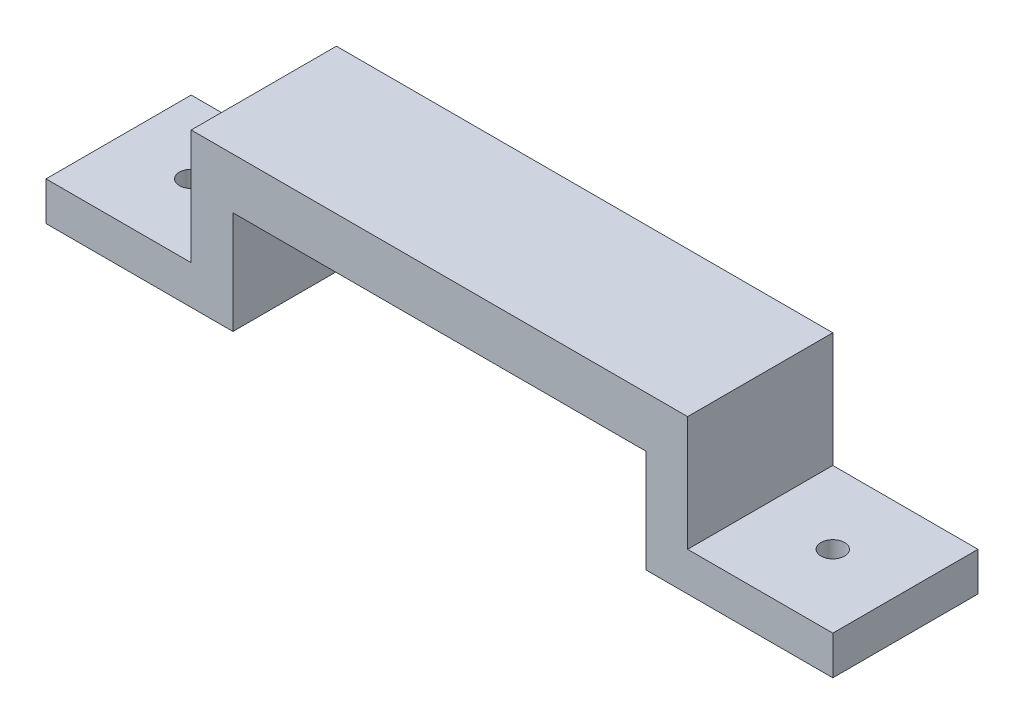
ISO-10303-21;
HEADER;
FILE_DESCRIPTION(('STEP AP214'),'2;1');
FILE_NAME('part.step','',(''),(''),'','','');
FILE_SCHEMA(('AUTOMOTIVE_DESIGN { 1 0 10303 214 1 1 1 1 }'));
ENDSEC;
DATA;
#1=APPLICATION_CONTEXT('core data for automotive mechanical design processes');
#2=APPLICATION_PROTOCOL_DEFINITION('international standard','automotive_design',2000,#1);
#3=PRODUCT_CONTEXT('',#1,'mechanical');
#4=PRODUCT('Part','Part','',(#3));
#5=PRODUCT_RELATED_PRODUCT_CATEGORY('part','',(#4));
#6=PRODUCT_DEFINITION_FORMATION('','',#4);
#7=PRODUCT_DEFINITION_CONTEXT('part definition',#1,'design');
#8=PRODUCT_DEFINITION('design','',#6,#7);
#9=PRODUCT_DEFINITION_SHAPE('','',#8);
#10=(LENGTH_UNIT() NAMED_UNIT(*) SI_UNIT(.MILLI.,.METRE.));
#11=(NAMED_UNIT(*) PLANE_ANGLE_UNIT() SI_UNIT($,.RADIAN.));
#12=(NAMED_UNIT(*) SI_UNIT($,.STERADIAN.) SOLID_ANGLE_UNIT());
#13=UNCERTAINTY_MEASURE_WITH_UNIT(LENGTH_MEASURE(1.E-05),#10,'distance_accuracy_value','');
#14=(GEOMETRIC_REPRESENTATION_CONTEXT(3) GLOBAL_UNCERTAINTY_ASSIGNED_CONTEXT((#13)) GLOBAL_UNIT_ASSIGNED_CONTEXT((#10,
#11,#12)) REPRESENTATION_CONTEXT('',''));
#15=CARTESIAN_POINT('',(0.,0.,0.));
#16=DIRECTION('',(0.,0.,1.));
#17=DIRECTION('',(1.,0.,0.));
#18=AXIS2_PLACEMENT_3D('',#15,#16,#17);
#19=CARTESIAN_POINT('',(29.9917995444191,0.,16.));
#20=DIRECTION('',(1.,0.,0.));
#21=DIRECTION('',(0.,0.,-1.));
#22=AXIS2_PLACEMENT_3D('',#19,#20,#21);
#23=PLANE('',#22);
#24=DIRECTION('',(0.,-1.,0.));
#25=VECTOR('',#24,1.);
#26=CARTESIAN_POINT('',(29.9917995444191,0.,16.));
#27=LINE('',#26,#25);
#28=CARTESIAN_POINT('',(29.9917995444191,7.06332574031891,16.));
#29=VERTEX_POINT('',#28);
#30=CARTESIAN_POINT('',(29.9917995444191,-4.26667425968109,16.));
#31=VERTEX_POINT('',#30);
#32=EDGE_CURVE('E68',#29,#31,#27,.T.);
#33=ORIENTED_EDGE('',*,*,#32,.F.);
#34=DIRECTION('',(0.,0.,1.));
#35=VECTOR('',#34,1.);
#36=CARTESIAN_POINT('',(29.9917995444191,7.06332574031891,16.));
#37=LINE('',#36,#35);
#38=CARTESIAN_POINT('',(29.9917995444191,7.06332574031891,0.));
#39=VERTEX_POINT('',#38);
#40=EDGE_CURVE('E284',#39,#29,#37,.T.);
#41=ORIENTED_EDGE('',*,*,#40,.F.);
#42=DIRECTION('',(0.,-1.,0.));
#43=VECTOR('',#42,1.);
#44=CARTESIAN_POINT('',(29.9917995444191,0.,0.));
#45=LINE('',#44,#43);
#46=CARTESIAN_POINT('',(29.9917995444191,-4.26667425968109,0.));
#47=VERTEX_POINT('',#46);
#48=EDGE_CURVE('E197',#39,#47,#45,.T.);
#49=ORIENTED_EDGE('',*,*,#48,.T.);
#50=DIRECTION('',(0.,0.,-1.));
#51=VECTOR('',#50,1.);
#52=CARTESIAN_POINT('',(29.9917995444191,-4.26667425968109,16.));
#53=LINE('',#52,#51);
#54=EDGE_CURVE('E11',#31,#47,#53,.T.);
#55=ORIENTED_EDGE('',*,*,#54,.F.);
#56=EDGE_LOOP('',(#33,#41,#49,#55));
#57=FACE_BOUND('',#56,.T.);
#58=ADVANCED_FACE('F45',(#57),#23,.F.);
#59=CARTESIAN_POINT('',(0.,-4.26667425968109,16.));
#60=DIRECTION('',(0.,1.,0.));
#61=DIRECTION('',(0.,0.,1.));
#62=AXIS2_PLACEMENT_3D('',#59,#60,#61);
#63=PLANE('',#62);
#64=CARTESIAN_POINT('',(42.5917995444191,-4.26667425968109,8.));
#65=DIRECTION('',(0.,1.,0.));
#66=DIRECTION('',(0.,0.,1.));
#67=AXIS2_PLACEMENT_3D('',#64,#65,#66);
#68=CIRCLE('',#67,1.3);
#69=CARTESIAN_POINT('',(42.5917995444191,-4.26667425968109,9.30000000000001));
#70=VERTEX_POINT('',#69);
#71=EDGE_CURVE('E259',#70,#70,#68,.T.);
#72=ORIENTED_EDGE('',*,*,#71,.T.);
#73=EDGE_LOOP('',(#72));
#74=FACE_BOUND('',#73,.T.);
#75=DIRECTION('',(1.,0.,0.));
#76=VECTOR('',#75,1.);
#77=CARTESIAN_POINT('',(0.,-4.26667425968109,0.));
#78=LINE('',#77,#76);
#79=CARTESIAN_POINT('',(50.5917995444191,-4.26667425968109,0.));
#80=VERTEX_POINT('',#79);
#81=EDGE_CURVE('E222',#47,#80,#78,.T.);
#82=ORIENTED_EDGE('',*,*,#81,.T.);
#83=DIRECTION('',(0.,0.,-1.));
#84=VECTOR('',#83,1.);
#85=CARTESIAN_POINT('',(50.5917995444191,-4.26667425968109,0.));
#86=LINE('',#85,#84);
#87=CARTESIAN_POINT('',(50.5917995444191,-4.26667425968109,16.));
#88=VERTEX_POINT('',#87);
#89=EDGE_CURVE('E153',#88,#80,#86,.T.);
#90=ORIENTED_EDGE('',*,*,#89,.F.);
#91=DIRECTION('',(1.,0.,0.));
#92=VECTOR('',#91,1.);
#93=CARTESIAN_POINT('',(0.,-4.26667425968109,16.));
#94=LINE('',#93,#92);
#95=EDGE_CURVE('E200',#31,#88,#94,.T.);
#96=ORIENTED_EDGE('',*,*,#95,.F.);
#97=ORIENTED_EDGE('',*,*,#54,.T.);
#98=EDGE_LOOP('',(#82,#90,#96,#97));
#99=FACE_BOUND('',#98,.T.);
#100=ADVANCED_FACE('F322',(#74,#99),#63,.F.);
#101=CARTESIAN_POINT('',(34.5917995444191,0.,16.));
#102=DIRECTION('',(1.,0.,0.));
#103=DIRECTION('',(0.,0.,-1.));
#104=AXIS2_PLACEMENT_3D('',#101,#102,#103);
#105=PLANE('',#104);
#106=DIRECTION('',(0.,0.,1.));
#107=VECTOR('',#106,1.);
#108=CARTESIAN_POINT('',(34.5917995444191,0.,0.));
#109=LINE('',#108,#107);
#110=CARTESIAN_POINT('',(34.5917995444191,0.,0.));
#111=VERTEX_POINT('',#110);
#112=CARTESIAN_POINT('',(34.5917995444191,0.,16.));
#113=VERTEX_POINT('',#112);
#114=EDGE_CURVE('E157',#111,#113,#109,.T.);
#115=ORIENTED_EDGE('',*,*,#114,.F.);
#116=DIRECTION('',(0.,-1.,0.));
#117=VECTOR('',#116,1.);
#118=CARTESIAN_POINT('',(34.5917995444191,0.,0.));
#119=LINE('',#118,#117);
#120=CARTESIAN_POINT('',(34.5917995444191,12.6633257403189,0.));
#121=VERTEX_POINT('',#120);
#122=EDGE_CURVE('E164',#121,#111,#119,.T.);
#123=ORIENTED_EDGE('',*,*,#122,.F.);
#124=DIRECTION('',(0.,0.,-1.));
#125=VECTOR('',#124,1.);
#126=CARTESIAN_POINT('',(34.5917995444191,12.6633257403189,16.));
#127=LINE('',#126,#125);
#128=CARTESIAN_POINT('',(34.5917995444191,12.6633257403189,16.));
#129=VERTEX_POINT('',#128);
#130=EDGE_CURVE('E53',#129,#121,#127,.T.);
#131=ORIENTED_EDGE('',*,*,#130,.F.);
#132=DIRECTION('',(0.,-1.,0.));
#133=VECTOR('',#132,1.);
#134=CARTESIAN_POINT('',(34.5917995444191,0.,16.));
#135=LINE('',#134,#133);
#136=EDGE_CURVE('E204',#129,#113,#135,.T.);
#137=ORIENTED_EDGE('',*,*,#136,.T.);
#138=EDGE_LOOP('',(#115,#123,#131,#137));
#139=FACE_BOUND('',#138,.T.);
#140=ADVANCED_FACE('F249',(#139),#105,.T.);
#141=CARTESIAN_POINT('',(0.,12.6633257403189,16.));
#142=DIRECTION('',(0.,1.,0.));
#143=DIRECTION('',(0.,0.,1.));
#144=AXIS2_PLACEMENT_3D('',#141,#142,#143);
#145=PLANE('',#144);
#146=DIRECTION('',(1.,0.,0.));
#147=VECTOR('',#146,1.);
#148=CARTESIAN_POINT('',(0.,12.6633257403189,0.));
#149=LINE('',#148,#147);
#150=CARTESIAN_POINT('',(-20.1082004555809,12.6633257403189,0.));
#151=VERTEX_POINT('',#150);
#152=EDGE_CURVE('E228',#151,#121,#149,.T.);
#153=ORIENTED_EDGE('',*,*,#152,.F.);
#154=DIRECTION('',(0.,0.,-1.));
#155=VECTOR('',#154,1.);
#156=CARTESIAN_POINT('',(-20.1082004555809,12.6633257403189,16.));
#157=LINE('',#156,#155);
#158=CARTESIAN_POINT('',(-20.1082004555809,12.6633257403189,16.));
#159=VERTEX_POINT('',#158);
#160=EDGE_CURVE('E240',#159,#151,#157,.T.);
#161=ORIENTED_EDGE('',*,*,#160,.F.);
#162=DIRECTION('',(1.,0.,0.));
#163=VECTOR('',#162,1.);
#164=CARTESIAN_POINT('',(0.,12.6633257403189,16.));
#165=LINE('',#164,#163);
#166=EDGE_CURVE('E208',#159,#129,#165,.T.);
#167=ORIENTED_EDGE('',*,*,#166,.T.);
#168=ORIENTED_EDGE('',*,*,#130,.T.);
#169=EDGE_LOOP('',(#153,#161,#167,#168));
#170=FACE_BOUND('',#169,.T.);
#171=ADVANCED_FACE('F245',(#170),#145,.T.);
#172=CARTESIAN_POINT('',(-20.1082004555809,0.,16.));
#173=DIRECTION('',(1.,0.,0.));
#174=DIRECTION('',(0.,0.,-1.));
#175=AXIS2_PLACEMENT_3D('',#172,#173,#174);
#176=PLANE('',#175);
#177=DIRECTION('',(0.,-1.,0.));
#178=VECTOR('',#177,1.);
#179=CARTESIAN_POINT('',(-20.1082004555809,0.,0.));
#180=LINE('',#179,#178);
#181=CARTESIAN_POINT('',(-20.1082004555809,0.,0.));
#182=VERTEX_POINT('',#181);
#183=EDGE_CURVE('E231',#151,#182,#180,.T.);
#184=ORIENTED_EDGE('',*,*,#183,.T.);
#185=DIRECTION('',(0.,0.,1.));
#186=VECTOR('',#185,1.);
#187=CARTESIAN_POINT('',(-20.1082004555809,0.,0.));
#188=LINE('',#187,#186);
#189=CARTESIAN_POINT('',(-20.1082004555809,0.,16.));
#190=VERTEX_POINT('',#189);
#191=EDGE_CURVE('E166',#182,#190,#188,.T.);
#192=ORIENTED_EDGE('',*,*,#191,.T.);
#193=DIRECTION('',(0.,-1.,0.));
#194=VECTOR('',#193,1.);
#195=CARTESIAN_POINT('',(-20.1082004555809,0.,16.));
#196=LINE('',#195,#194);
#197=EDGE_CURVE('E212',#159,#190,#196,.T.);
#198=ORIENTED_EDGE('',*,*,#197,.F.);
#199=ORIENTED_EDGE('',*,*,#160,.T.);
#200=EDGE_LOOP('',(#184,#192,#198,#199));
#201=FACE_BOUND('',#200,.T.);
#202=ADVANCED_FACE('F254',(#201),#176,.F.);
#203=CARTESIAN_POINT('',(-28.1082004555809,-4.26667425968109,8.));
#204=DIRECTION('',(0.,1.,0.));
#205=DIRECTION('',(0.,0.,1.));
#206=AXIS2_PLACEMENT_3D('',#203,#204,#205);
#207=CIRCLE('',#206,1.3);
#208=CARTESIAN_POINT('',(-28.1082004555809,-4.26667425968109,9.3));
#209=VERTEX_POINT('',#208);
#210=EDGE_CURVE('E272',#209,#209,#207,.T.);
#211=ORIENTED_EDGE('',*,*,#210,.T.);
#212=EDGE_LOOP('',(#211));
#213=FACE_BOUND('',#212,.T.);
#214=CARTESIAN_POINT('',(-36.1082004555809,-4.26667425968109,0.));
#215=VERTEX_POINT('',#214);
#216=CARTESIAN_POINT('',(-15.5082004555809,-4.26667425968109,0.));
#217=VERTEX_POINT('',#216);
#218=EDGE_CURVE('E225',#215,#217,#78,.T.);
#219=ORIENTED_EDGE('',*,*,#218,.T.);
#220=DIRECTION('',(0.,0.,-1.));
#221=VECTOR('',#220,1.);
#222=CARTESIAN_POINT('',(-15.5082004555809,-4.26667425968109,16.));
#223=LINE('',#222,#221);
#224=CARTESIAN_POINT('',(-15.5082004555809,-4.26667425968109,16.));
#225=VERTEX_POINT('',#224);
#226=EDGE_CURVE('E219',#225,#217,#223,.T.);
#227=ORIENTED_EDGE('',*,*,#226,.F.);
#228=CARTESIAN_POINT('',(-36.1082004555809,-4.26667425968109,16.));
#229=VERTEX_POINT('',#228);
#230=EDGE_CURVE('E205',#229,#225,#94,.T.);
#231=ORIENTED_EDGE('',*,*,#230,.F.);
#232=DIRECTION('',(0.,0.,1.));
#233=VECTOR('',#232,1.);
#234=CARTESIAN_POINT('',(-36.1082004555809,-4.26667425968109,0.));
#235=LINE('',#234,#233);
#236=EDGE_CURVE('E171',#215,#229,#235,.T.);
#237=ORIENTED_EDGE('',*,*,#236,.F.);
#238=EDGE_LOOP('',(#219,#227,#231,#237));
#239=FACE_BOUND('',#238,.T.);
#240=ADVANCED_FACE('F301',(#213,#239),#63,.F.);
#241=CARTESIAN_POINT('',(-15.5082004555809,0.,16.));
#242=DIRECTION('',(1.,0.,0.));
#243=DIRECTION('',(0.,0.,-1.));
#244=AXIS2_PLACEMENT_3D('',#241,#242,#243);
#245=PLANE('',#244);
#246=DIRECTION('',(0.,0.,-1.));
#247=VECTOR('',#246,1.);
#248=CARTESIAN_POINT('',(-15.5082004555809,7.06332574031891,16.));
#249=LINE('',#248,#247);
#250=CARTESIAN_POINT('',(-15.5082004555809,7.06332574031891,16.));
#251=VERTEX_POINT('',#250);
#252=CARTESIAN_POINT('',(-15.5082004555809,7.06332574031891,0.));
#253=VERTEX_POINT('',#252);
#254=EDGE_CURVE('E60',#251,#253,#249,.T.);
#255=ORIENTED_EDGE('',*,*,#254,.F.);
#256=DIRECTION('',(0.,-1.,0.));
#257=VECTOR('',#256,1.);
#258=CARTESIAN_POINT('',(-15.5082004555809,0.,16.));
#259=LINE('',#258,#257);
#260=EDGE_CURVE('E216',#251,#225,#259,.T.);
#261=ORIENTED_EDGE('',*,*,#260,.T.);
#262=ORIENTED_EDGE('',*,*,#226,.T.);
#263=DIRECTION('',(0.,-1.,0.));
#264=VECTOR('',#263,1.);
#265=CARTESIAN_POINT('',(-15.5082004555809,0.,0.));
#266=LINE('',#265,#264);
#267=EDGE_CURVE('E201',#253,#217,#266,.T.);
#268=ORIENTED_EDGE('',*,*,#267,.F.);
#269=EDGE_LOOP('',(#255,#261,#262,#268));
#270=FACE_BOUND('',#269,.T.);
#271=ADVANCED_FACE('F297',(#270),#245,.T.);
#272=CARTESIAN_POINT('',(0.,0.,16.));
#273=DIRECTION('',(0.,0.,1.));
#274=DIRECTION('',(1.,0.,0.));
#275=AXIS2_PLACEMENT_3D('',#272,#273,#274);
#276=PLANE('',#275);
#277=ORIENTED_EDGE('',*,*,#260,.F.);
#278=DIRECTION('',(-1.,0.,0.));
#279=VECTOR('',#278,1.);
#280=CARTESIAN_POINT('',(-15.5082004555809,7.06332574031891,16.));
#281=LINE('',#280,#279);
#282=EDGE_CURVE('E280',#29,#251,#281,.T.);
#283=ORIENTED_EDGE('',*,*,#282,.F.);
#284=ORIENTED_EDGE('',*,*,#32,.T.);
#285=ORIENTED_EDGE('',*,*,#95,.T.);
#286=DIRECTION('',(0.,-1.,0.));
#287=VECTOR('',#286,1.);
#288=CARTESIAN_POINT('',(50.5917995444191,0.,16.));
#289=LINE('',#288,#287);
#290=CARTESIAN_POINT('',(50.5917995444191,0.,16.));
#291=VERTEX_POINT('',#290);
#292=EDGE_CURVE('E146',#291,#88,#289,.T.);
#293=ORIENTED_EDGE('',*,*,#292,.F.);
#294=DIRECTION('',(-1.,0.,0.));
#295=VECTOR('',#294,1.);
#296=CARTESIAN_POINT('',(50.5917995444191,0.,16.));
#297=LINE('',#296,#295);
#298=EDGE_CURVE('E141',#291,#113,#297,.T.);
#299=ORIENTED_EDGE('',*,*,#298,.T.);
#300=ORIENTED_EDGE('',*,*,#136,.F.);
#301=ORIENTED_EDGE('',*,*,#166,.F.);
#302=ORIENTED_EDGE('',*,*,#197,.T.);
#303=DIRECTION('',(1.,0.,0.));
#304=VECTOR('',#303,1.);
#305=CARTESIAN_POINT('',(-36.1082004555809,0.,16.));
#306=LINE('',#305,#304);
#307=CARTESIAN_POINT('',(-36.1082004555809,0.,16.));
#308=VERTEX_POINT('',#307);
#309=EDGE_CURVE('E194',#308,#190,#306,.T.);
#310=ORIENTED_EDGE('',*,*,#309,.F.);
#311=DIRECTION('',(0.,-1.,0.));
#312=VECTOR('',#311,1.);
#313=CARTESIAN_POINT('',(-36.1082004555809,0.,16.));
#314=LINE('',#313,#312);
#315=EDGE_CURVE('E179',#308,#229,#314,.T.);
#316=ORIENTED_EDGE('',*,*,#315,.T.);
#317=ORIENTED_EDGE('',*,*,#230,.T.);
#318=EDGE_LOOP('',(#277,#283,#284,#285,#293,#299,#300,#301,#302,#310,#316,#317));
#319=FACE_BOUND('',#318,.T.);
#320=ADVANCED_FACE('F257',(#319),#276,.T.);
#321=CARTESIAN_POINT('',(0.,0.,0.));
#322=DIRECTION('',(0.,0.,1.));
#323=DIRECTION('',(1.,0.,0.));
#324=AXIS2_PLACEMENT_3D('',#321,#322,#323);
#325=PLANE('',#324);
#326=DIRECTION('',(1.,0.,0.));
#327=VECTOR('',#326,1.);
#328=CARTESIAN_POINT('',(-15.5082004555809,7.06332574031891,0.));
#329=LINE('',#328,#327);
#330=EDGE_CURVE('E287',#253,#39,#329,.T.);
#331=ORIENTED_EDGE('',*,*,#330,.F.);
#332=ORIENTED_EDGE('',*,*,#267,.T.);
#333=ORIENTED_EDGE('',*,*,#218,.F.);
#334=DIRECTION('',(0.,-1.,0.));
#335=VECTOR('',#334,1.);
#336=CARTESIAN_POINT('',(-36.1082004555809,0.,0.));
#337=LINE('',#336,#335);
#338=CARTESIAN_POINT('',(-36.1082004555809,0.,0.));
#339=VERTEX_POINT('',#338);
#340=EDGE_CURVE('E187',#339,#215,#337,.T.);
#341=ORIENTED_EDGE('',*,*,#340,.F.);
#342=DIRECTION('',(1.,0.,0.));
#343=VECTOR('',#342,1.);
#344=CARTESIAN_POINT('',(-36.1082004555809,0.,0.));
#345=LINE('',#344,#343);
#346=EDGE_CURVE('E190',#339,#182,#345,.T.);
#347=ORIENTED_EDGE('',*,*,#346,.T.);
#348=ORIENTED_EDGE('',*,*,#183,.F.);
#349=ORIENTED_EDGE('',*,*,#152,.T.);
#350=ORIENTED_EDGE('',*,*,#122,.T.);
#351=DIRECTION('',(-1.,0.,0.));
#352=VECTOR('',#351,1.);
#353=CARTESIAN_POINT('',(50.5917995444191,0.,0.));
#354=LINE('',#353,#352);
#355=CARTESIAN_POINT('',(50.5917995444191,0.,0.));
#356=VERTEX_POINT('',#355);
#357=EDGE_CURVE('E139',#356,#111,#354,.T.);
#358=ORIENTED_EDGE('',*,*,#357,.F.);
#359=DIRECTION('',(0.,1.,0.));
#360=VECTOR('',#359,1.);
#361=CARTESIAN_POINT('',(50.5917995444191,0.,0.));
#362=LINE('',#361,#360);
#363=EDGE_CURVE('E147',#80,#356,#362,.T.);
#364=ORIENTED_EDGE('',*,*,#363,.F.);
#365=ORIENTED_EDGE('',*,*,#81,.F.);
#366=ORIENTED_EDGE('',*,*,#48,.F.);
#367=EDGE_LOOP('',(#331,#332,#333,#341,#347,#348,#349,#350,#358,#364,#365,#366));
#368=FACE_BOUND('',#367,.T.);
#369=ADVANCED_FACE('F161',(#368),#325,.F.);
#370=CARTESIAN_POINT('',(-36.1082004555809,0.,0.));
#371=DIRECTION('',(0.,1.,0.));
#372=DIRECTION('',(0.,0.,1.));
#373=AXIS2_PLACEMENT_3D('',#370,#371,#372);
#374=PLANE('',#373);
#375=CARTESIAN_POINT('',(-28.1082004555809,0.,8.));
#376=DIRECTION('',(0.,1.,0.));
#377=DIRECTION('',(0.,0.,1.));
#378=AXIS2_PLACEMENT_3D('',#375,#376,#377);
#379=CIRCLE('',#378,1.3);
#380=CARTESIAN_POINT('',(-28.1082004555809,0.,9.3));
#381=VERTEX_POINT('',#380);
#382=EDGE_CURVE('E276',#381,#381,#379,.T.);
#383=ORIENTED_EDGE('',*,*,#382,.F.);
#384=EDGE_LOOP('',(#383));
#385=FACE_BOUND('',#384,.T.);
#386=ORIENTED_EDGE('',*,*,#191,.F.);
#387=ORIENTED_EDGE('',*,*,#346,.F.);
#388=DIRECTION('',(0.,0.,1.));
#389=VECTOR('',#388,1.);
#390=CARTESIAN_POINT('',(-36.1082004555809,0.,0.));
#391=LINE('',#390,#389);
#392=EDGE_CURVE('E183',#339,#308,#391,.T.);
#393=ORIENTED_EDGE('',*,*,#392,.T.);
#394=ORIENTED_EDGE('',*,*,#309,.T.);
#395=EDGE_LOOP('',(#386,#387,#393,#394));
#396=FACE_BOUND('',#395,.T.);
#397=ADVANCED_FACE('F309',(#385,#396),#374,.T.);
#398=CARTESIAN_POINT('',(-36.1082004555809,0.,0.));
#399=DIRECTION('',(1.,0.,0.));
#400=DIRECTION('',(0.,0.,-1.));
#401=AXIS2_PLACEMENT_3D('',#398,#399,#400);
#402=PLANE('',#401);
#403=ORIENTED_EDGE('',*,*,#236,.T.);
#404=ORIENTED_EDGE('',*,*,#315,.F.);
#405=ORIENTED_EDGE('',*,*,#392,.F.);
#406=ORIENTED_EDGE('',*,*,#340,.T.);
#407=EDGE_LOOP('',(#403,#404,#405,#406));
#408=FACE_BOUND('',#407,.T.);
#409=ADVANCED_FACE('F306',(#408),#402,.F.);
#410=CARTESIAN_POINT('',(50.5917995444191,0.,0.));
#411=DIRECTION('',(0.,-1.,0.));
#412=DIRECTION('',(0.,0.,-1.));
#413=AXIS2_PLACEMENT_3D('',#410,#411,#412);
#414=PLANE('',#413);
#415=CARTESIAN_POINT('',(42.5917995444191,0.,8.));
#416=DIRECTION('',(0.,1.,0.));
#417=DIRECTION('',(0.,0.,1.));
#418=AXIS2_PLACEMENT_3D('',#415,#416,#417);
#419=CIRCLE('',#418,1.3);
#420=CARTESIAN_POINT('',(42.5917995444191,0.,9.30000000000001));
#421=VERTEX_POINT('',#420);
#422=EDGE_CURVE('E262',#421,#421,#419,.T.);
#423=ORIENTED_EDGE('',*,*,#422,.F.);
#424=EDGE_LOOP('',(#423));
#425=FACE_BOUND('',#424,.T.);
#426=ORIENTED_EDGE('',*,*,#114,.T.);
#427=ORIENTED_EDGE('',*,*,#298,.F.);
#428=DIRECTION('',(0.,0.,1.));
#429=VECTOR('',#428,1.);
#430=CARTESIAN_POINT('',(50.5917995444191,0.,0.));
#431=LINE('',#430,#429);
#432=EDGE_CURVE('E134',#356,#291,#431,.T.);
#433=ORIENTED_EDGE('',*,*,#432,.F.);
#434=ORIENTED_EDGE('',*,*,#357,.T.);
#435=EDGE_LOOP('',(#426,#427,#433,#434));
#436=FACE_BOUND('',#435,.T.);
#437=ADVANCED_FACE('F137',(#425,#436),#414,.F.);
#438=CARTESIAN_POINT('',(50.5917995444191,0.,0.));
#439=DIRECTION('',(-1.,0.,0.));
#440=DIRECTION('',(0.,0.,1.));
#441=AXIS2_PLACEMENT_3D('',#438,#439,#440);
#442=PLANE('',#441);
#443=ORIENTED_EDGE('',*,*,#363,.T.);
#444=ORIENTED_EDGE('',*,*,#432,.T.);
#445=ORIENTED_EDGE('',*,*,#292,.T.);
#446=ORIENTED_EDGE('',*,*,#89,.T.);
#447=EDGE_LOOP('',(#443,#444,#445,#446));
#448=FACE_BOUND('',#447,.T.);
#449=ADVANCED_FACE('F151',(#448),#442,.F.);
#450=CARTESIAN_POINT('',(42.5917995444191,0.,8.));
#451=DIRECTION('',(0.,1.,0.));
#452=DIRECTION('',(0.,0.,1.));
#453=AXIS2_PLACEMENT_3D('',#450,#451,#452);
#454=CYLINDRICAL_SURFACE('',#453,1.3);
#455=ORIENTED_EDGE('',*,*,#71,.F.);
#456=EDGE_LOOP('',(#455));
#457=FACE_BOUND('',#456,.T.);
#458=ORIENTED_EDGE('',*,*,#422,.T.);
#459=EDGE_LOOP('',(#458));
#460=FACE_BOUND('',#459,.T.);
#461=ADVANCED_FACE('F345',(#457,#460),#454,.F.);
#462=CARTESIAN_POINT('',(-28.1082004555809,0.,8.));
#463=DIRECTION('',(0.,1.,0.));
#464=DIRECTION('',(0.,0.,1.));
#465=AXIS2_PLACEMENT_3D('',#462,#463,#464);
#466=CYLINDRICAL_SURFACE('',#465,1.3);
#467=ORIENTED_EDGE('',*,*,#210,.F.);
#468=EDGE_LOOP('',(#467));
#469=FACE_BOUND('',#468,.T.);
#470=ORIENTED_EDGE('',*,*,#382,.T.);
#471=EDGE_LOOP('',(#470));
#472=FACE_BOUND('',#471,.T.);
#473=ADVANCED_FACE('F342',(#469,#472),#466,.F.);
#474=CARTESIAN_POINT('',(0.,7.06332574031891,0.));
#475=DIRECTION('',(0.,-1.,0.));
#476=DIRECTION('',(0.,0.,-1.));
#477=AXIS2_PLACEMENT_3D('',#474,#475,#476);
#478=PLANE('',#477);
#479=ORIENTED_EDGE('',*,*,#254,.T.);
#480=ORIENTED_EDGE('',*,*,#330,.T.);
#481=ORIENTED_EDGE('',*,*,#40,.T.);
#482=ORIENTED_EDGE('',*,*,#282,.T.);
#483=EDGE_LOOP('',(#479,#480,#481,#482));
#484=FACE_BOUND('',#483,.T.);
#485=ADVANCED_FACE('F293',(#484),#478,.T.);
#486=CLOSED_SHELL('',(#58,#100,#140,#171,#202,#240,#271,#320,#369,#397,#409,#437,#449,#461,#473,#485));
#487=MANIFOLD_SOLID_BREP('B2',#486);
#488=ADVANCED_BREP_SHAPE_REPRESENTATION('',(#18,#487),#14);
#489=SHAPE_DEFINITION_REPRESENTATION(#9,#488);
ENDSEC;
END-ISO-10303-21;
